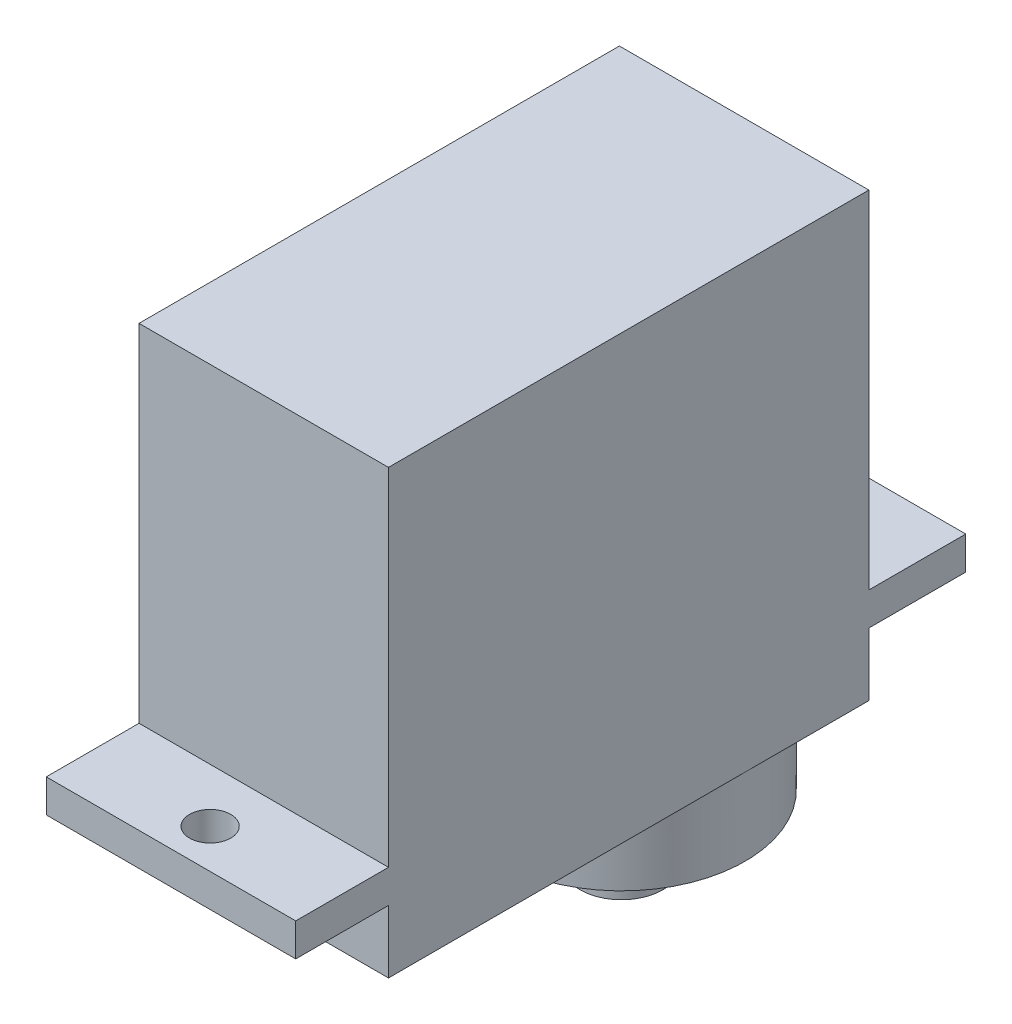
ISO-10303-21;
HEADER;
FILE_DESCRIPTION(('STEP AP214'),'2;1');
FILE_NAME('part.step','',(''),(''),'','','');
FILE_SCHEMA(('AUTOMOTIVE_DESIGN { 1 0 10303 214 1 1 1 1 }'));
ENDSEC;
DATA;
#1=APPLICATION_CONTEXT('core data for automotive mechanical design processes');
#2=APPLICATION_PROTOCOL_DEFINITION('international standard','automotive_design',2000,#1);
#3=PRODUCT_CONTEXT('',#1,'mechanical');
#4=PRODUCT('Part','Part','',(#3));
#5=PRODUCT_RELATED_PRODUCT_CATEGORY('part','',(#4));
#6=PRODUCT_DEFINITION_FORMATION('','',#4);
#7=PRODUCT_DEFINITION_CONTEXT('part definition',#1,'design');
#8=PRODUCT_DEFINITION('design','',#6,#7);
#9=PRODUCT_DEFINITION_SHAPE('','',#8);
#10=(LENGTH_UNIT() NAMED_UNIT(*) SI_UNIT(.MILLI.,.METRE.));
#11=(NAMED_UNIT(*) PLANE_ANGLE_UNIT() SI_UNIT($,.RADIAN.));
#12=(NAMED_UNIT(*) SI_UNIT($,.STERADIAN.) SOLID_ANGLE_UNIT());
#13=UNCERTAINTY_MEASURE_WITH_UNIT(LENGTH_MEASURE(1.E-05),#10,'distance_accuracy_value','');
#14=(GEOMETRIC_REPRESENTATION_CONTEXT(3) GLOBAL_UNCERTAINTY_ASSIGNED_CONTEXT((#13)) GLOBAL_UNIT_ASSIGNED_CONTEXT((#10,
#11,#12)) REPRESENTATION_CONTEXT('',''));
#15=CARTESIAN_POINT('',(0.,0.,0.));
#16=DIRECTION('',(0.,0.,1.));
#17=DIRECTION('',(1.,0.,0.));
#18=AXIS2_PLACEMENT_3D('',#15,#16,#17);
#19=CARTESIAN_POINT('',(4.62906680834214E-07,-15.5159,-5.00154516457114));
#20=DIRECTION('',(0.,1.,0.));
#21=DIRECTION('',(0.,0.,1.));
#22=AXIS2_PLACEMENT_3D('',#19,#20,#21);
#23=CYLINDRICAL_SURFACE('',#22,1.99999996773667);
#24=CARTESIAN_POINT('',(4.62906680834214E-07,-15.5159,-5.00154516457114));
#25=DIRECTION('',(0.,1.,0.));
#26=DIRECTION('',(0.,0.,1.));
#27=AXIS2_PLACEMENT_3D('',#24,#25,#26);
#28=CIRCLE('',#27,1.99999996773667);
#29=CARTESIAN_POINT('',(4.62906680834214E-07,-15.5159,-3.00154519683447));
#30=VERTEX_POINT('',#29);
#31=EDGE_CURVE('E12',#30,#30,#28,.T.);
#32=ORIENTED_EDGE('',*,*,#31,.T.);
#33=EDGE_LOOP('',(#32));
#34=FACE_BOUND('',#33,.T.);
#35=CARTESIAN_POINT('',(4.62906680834214E-07,-12.3159,-5.00154516457114));
#36=DIRECTION('',(0.,1.,0.));
#37=DIRECTION('',(0.,0.,1.));
#38=AXIS2_PLACEMENT_3D('',#35,#36,#37);
#39=CIRCLE('',#38,1.99999996773667);
#40=CARTESIAN_POINT('',(4.62906680834214E-07,-12.3159,-3.00154519683447));
#41=VERTEX_POINT('',#40);
#42=EDGE_CURVE('E62',#41,#41,#39,.T.);
#43=ORIENTED_EDGE('',*,*,#42,.F.);
#44=EDGE_LOOP('',(#43));
#45=FACE_BOUND('',#44,.T.);
#46=ADVANCED_FACE('F59',(#34,#45),#23,.T.);
#47=CARTESIAN_POINT('',(0.,-12.3159,0.));
#48=DIRECTION('',(0.,1.,0.));
#49=DIRECTION('',(0.,0.,1.));
#50=AXIS2_PLACEMENT_3D('',#47,#48,#49);
#51=PLANE('',#50);
#52=CARTESIAN_POINT('',(4.62906680834214E-07,-12.3159,-5.00154516457114));
#53=DIRECTION('',(0.,1.,0.));
#54=DIRECTION('',(0.,0.,1.));
#55=AXIS2_PLACEMENT_3D('',#52,#53,#54);
#56=CIRCLE('',#55,1.25000000033662);
#57=CARTESIAN_POINT('',(4.62906680834214E-07,-12.3159,-3.75154516423452));
#58=VERTEX_POINT('',#57);
#59=EDGE_CURVE('E69',#58,#58,#56,.T.);
#60=ORIENTED_EDGE('',*,*,#59,.F.);
#61=EDGE_LOOP('',(#60));
#62=FACE_BOUND('',#61,.T.);
#63=ORIENTED_EDGE('',*,*,#42,.T.);
#64=EDGE_LOOP('',(#63));
#65=FACE_BOUND('',#64,.T.);
#66=ADVANCED_FACE('F87',(#62,#65),#51,.T.);
#67=CARTESIAN_POINT('',(0.,-15.5159,0.));
#68=DIRECTION('',(0.,1.,0.));
#69=DIRECTION('',(0.,0.,1.));
#70=AXIS2_PLACEMENT_3D('',#67,#68,#69);
#71=PLANE('',#70);
#72=CARTESIAN_POINT('',(4.62906680834214E-07,-15.5159,-5.00154516457114));
#73=DIRECTION('',(0.,1.,0.));
#74=DIRECTION('',(0.,0.,1.));
#75=AXIS2_PLACEMENT_3D('',#72,#73,#74);
#76=CIRCLE('',#75,1.25000000033662);
#77=CARTESIAN_POINT('',(4.62906680834214E-07,-15.5159,-3.75154516423452));
#78=VERTEX_POINT('',#77);
#79=EDGE_CURVE('E73',#78,#78,#76,.T.);
#80=ORIENTED_EDGE('',*,*,#79,.T.);
#81=EDGE_LOOP('',(#80));
#82=FACE_BOUND('',#81,.T.);
#83=ORIENTED_EDGE('',*,*,#31,.F.);
#84=EDGE_LOOP('',(#83));
#85=FACE_BOUND('',#84,.T.);
#86=ADVANCED_FACE('F77',(#82,#85),#71,.F.);
#87=CARTESIAN_POINT('',(4.62906680834214E-07,-15.5159,-5.00154516457114));
#88=DIRECTION('',(0.,1.,0.));
#89=DIRECTION('',(0.,0.,1.));
#90=AXIS2_PLACEMENT_3D('',#87,#88,#89);
#91=CYLINDRICAL_SURFACE('',#90,1.25000000033662);
#92=ORIENTED_EDGE('',*,*,#59,.T.);
#93=EDGE_LOOP('',(#92));
#94=FACE_BOUND('',#93,.T.);
#95=ORIENTED_EDGE('',*,*,#79,.F.);
#96=EDGE_LOOP('',(#95));
#97=FACE_BOUND('',#96,.T.);
#98=ADVANCED_FACE('F80',(#94,#97),#91,.F.);
#99=CLOSED_SHELL('',(#46,#66,#86,#98));
#100=MANIFOLD_SOLID_BREP('B2',#99);
#101=CARTESIAN_POINT('',(6.05,-8.5159,16.8485));
#102=DIRECTION('',(0.,0.,-1.));
#103=DIRECTION('',(-1.,0.,0.));
#104=AXIS2_PLACEMENT_3D('',#101,#102,#103);
#105=PLANE('',#104);
#106=DIRECTION('',(-1.,0.,0.));
#107=VECTOR('',#106,1.);
#108=CARTESIAN_POINT('',(6.05,-5.46581,16.8485));
#109=LINE('',#108,#107);
#110=CARTESIAN_POINT('',(6.05,-5.46581,16.8485));
#111=VERTEX_POINT('',#110);
#112=CARTESIAN_POINT('',(-6.05,-5.46581,16.8485));
#113=VERTEX_POINT('',#112);
#114=EDGE_CURVE('E138',#111,#113,#109,.T.);
#115=ORIENTED_EDGE('',*,*,#114,.F.);
#116=DIRECTION('',(0.,-1.,0.));
#117=VECTOR('',#116,1.);
#118=CARTESIAN_POINT('',(6.05,-8.5159,16.8485));
#119=LINE('',#118,#117);
#120=CARTESIAN_POINT('',(6.05,-3.86581,16.8485));
#121=VERTEX_POINT('',#120);
#122=EDGE_CURVE('E311',#121,#111,#119,.T.);
#123=ORIENTED_EDGE('',*,*,#122,.F.);
#124=DIRECTION('',(-1.,0.,0.));
#125=VECTOR('',#124,1.);
#126=CARTESIAN_POINT('',(6.05,-3.86581,16.8485));
#127=LINE('',#126,#125);
#128=CARTESIAN_POINT('',(-6.05,-3.86581,16.8485));
#129=VERTEX_POINT('',#128);
#130=EDGE_CURVE('E292',#121,#129,#127,.T.);
#131=ORIENTED_EDGE('',*,*,#130,.T.);
#132=DIRECTION('',(0.,-1.,0.));
#133=VECTOR('',#132,1.);
#134=CARTESIAN_POINT('',(-6.05,-8.5159,16.8485));
#135=LINE('',#134,#133);
#136=EDGE_CURVE('E310',#129,#113,#135,.T.);
#137=ORIENTED_EDGE('',*,*,#136,.T.);
#138=EDGE_LOOP('',(#115,#123,#131,#137));
#139=FACE_BOUND('',#138,.T.);
#140=ADVANCED_FACE('F130',(#139),#105,.F.);
#141=CARTESIAN_POINT('',(6.05,-8.5159,-15.6515));
#142=DIRECTION('',(0.,0.,1.));
#143=DIRECTION('',(1.,0.,0.));
#144=AXIS2_PLACEMENT_3D('',#141,#142,#143);
#145=PLANE('',#144);
#146=DIRECTION('',(1.,0.,0.));
#147=VECTOR('',#146,1.);
#148=CARTESIAN_POINT('',(6.05,-5.46581,-15.6515));
#149=LINE('',#148,#147);
#150=CARTESIAN_POINT('',(-6.05,-5.46581,-15.6515));
#151=VERTEX_POINT('',#150);
#152=CARTESIAN_POINT('',(6.05,-5.46581,-15.6515));
#153=VERTEX_POINT('',#152);
#154=EDGE_CURVE('E332',#151,#153,#149,.T.);
#155=ORIENTED_EDGE('',*,*,#154,.F.);
#156=DIRECTION('',(0.,1.,0.));
#157=VECTOR('',#156,1.);
#158=CARTESIAN_POINT('',(-6.05,-8.5159,-15.6515));
#159=LINE('',#158,#157);
#160=CARTESIAN_POINT('',(-6.05,-3.86581,-15.6515));
#161=VERTEX_POINT('',#160);
#162=EDGE_CURVE('E327',#151,#161,#159,.T.);
#163=ORIENTED_EDGE('',*,*,#162,.T.);
#164=DIRECTION('',(1.,0.,0.));
#165=VECTOR('',#164,1.);
#166=CARTESIAN_POINT('',(6.05,-3.86581,-15.6515));
#167=LINE('',#166,#165);
#168=CARTESIAN_POINT('',(6.05,-3.86581,-15.6515));
#169=VERTEX_POINT('',#168);
#170=EDGE_CURVE('E307',#161,#169,#167,.T.);
#171=ORIENTED_EDGE('',*,*,#170,.T.);
#172=DIRECTION('',(0.,1.,0.));
#173=VECTOR('',#172,1.);
#174=CARTESIAN_POINT('',(6.05,-8.5159,-15.6515));
#175=LINE('',#174,#173);
#176=EDGE_CURVE('E318',#153,#169,#175,.T.);
#177=ORIENTED_EDGE('',*,*,#176,.F.);
#178=EDGE_LOOP('',(#155,#163,#171,#177));
#179=FACE_BOUND('',#178,.T.);
#180=ADVANCED_FACE('F368',(#179),#145,.F.);
#181=CARTESIAN_POINT('',(6.05,12.9341,16.8485));
#182=DIRECTION('',(0.,-1.,0.));
#183=DIRECTION('',(0.,0.,-1.));
#184=AXIS2_PLACEMENT_3D('',#181,#182,#183);
#185=PLANE('',#184);
#186=DIRECTION('',(1.,0.,0.));
#187=VECTOR('',#186,1.);
#188=CARTESIAN_POINT('',(-6.05,12.9341,-10.95155));
#189=LINE('',#188,#187);
#190=CARTESIAN_POINT('',(-6.05,12.9341,-10.95155));
#191=VERTEX_POINT('',#190);
#192=CARTESIAN_POINT('',(6.05,12.9341,-10.95155));
#193=VERTEX_POINT('',#192);
#194=EDGE_CURVE('E278',#191,#193,#189,.T.);
#195=ORIENTED_EDGE('',*,*,#194,.F.);
#196=DIRECTION('',(0.,0.,1.));
#197=VECTOR('',#196,1.);
#198=CARTESIAN_POINT('',(-6.05,12.9341,16.8485));
#199=LINE('',#198,#197);
#200=CARTESIAN_POINT('',(-6.05,12.9341,12.3484));
#201=VERTEX_POINT('',#200);
#202=EDGE_CURVE('E315',#191,#201,#199,.T.);
#203=ORIENTED_EDGE('',*,*,#202,.T.);
#204=DIRECTION('',(-1.,0.,0.));
#205=VECTOR('',#204,1.);
#206=CARTESIAN_POINT('',(-6.05,12.9341,12.3484));
#207=LINE('',#206,#205);
#208=CARTESIAN_POINT('',(6.05,12.9341,12.3484));
#209=VERTEX_POINT('',#208);
#210=EDGE_CURVE('E297',#209,#201,#207,.T.);
#211=ORIENTED_EDGE('',*,*,#210,.F.);
#212=DIRECTION('',(0.,0.,1.));
#213=VECTOR('',#212,1.);
#214=CARTESIAN_POINT('',(6.05,12.9341,16.8485));
#215=LINE('',#214,#213);
#216=EDGE_CURVE('E320',#193,#209,#215,.T.);
#217=ORIENTED_EDGE('',*,*,#216,.F.);
#218=EDGE_LOOP('',(#195,#203,#211,#217));
#219=FACE_BOUND('',#218,.T.);
#220=ADVANCED_FACE('F385',(#219),#185,.F.);
#221=CARTESIAN_POINT('',(6.05,0.,0.));
#222=DIRECTION('',(-1.,0.,0.));
#223=DIRECTION('',(0.,0.,1.));
#224=AXIS2_PLACEMENT_3D('',#221,#222,#223);
#225=PLANE('',#224);
#226=DIRECTION('',(0.,0.,-1.));
#227=VECTOR('',#226,1.);
#228=CARTESIAN_POINT('',(6.05,-8.5159,16.8485));
#229=LINE('',#228,#227);
#230=CARTESIAN_POINT('',(6.05,-8.5159,12.3484));
#231=VERTEX_POINT('',#230);
#232=CARTESIAN_POINT('',(6.05,-8.5159,-10.95155));
#233=VERTEX_POINT('',#232);
#234=EDGE_CURVE('E314',#231,#233,#229,.T.);
#235=ORIENTED_EDGE('',*,*,#234,.T.);
#236=DIRECTION('',(0.,1.,0.));
#237=VECTOR('',#236,1.);
#238=CARTESIAN_POINT('',(6.05,-8.5159,-10.95155));
#239=LINE('',#238,#237);
#240=CARTESIAN_POINT('',(6.05,-5.46581,-10.95155));
#241=VERTEX_POINT('',#240);
#242=EDGE_CURVE('E247',#233,#241,#239,.T.);
#243=ORIENTED_EDGE('',*,*,#242,.T.);
#244=DIRECTION('',(0.,0.,-1.));
#245=VECTOR('',#244,1.);
#246=CARTESIAN_POINT('',(6.05,-5.46581,-10.95155));
#247=LINE('',#246,#245);
#248=EDGE_CURVE('E251',#241,#153,#247,.T.);
#249=ORIENTED_EDGE('',*,*,#248,.T.);
#250=ORIENTED_EDGE('',*,*,#176,.T.);
#251=DIRECTION('',(0.,0.,-1.));
#252=VECTOR('',#251,1.);
#253=CARTESIAN_POINT('',(6.05,-3.86581,-10.95155));
#254=LINE('',#253,#252);
#255=CARTESIAN_POINT('',(6.05,-3.86581,-10.95155));
#256=VERTEX_POINT('',#255);
#257=EDGE_CURVE('E281',#256,#169,#254,.T.);
#258=ORIENTED_EDGE('',*,*,#257,.F.);
#259=DIRECTION('',(0.,-1.,0.));
#260=VECTOR('',#259,1.);
#261=CARTESIAN_POINT('',(6.05,12.9341,-10.95155));
#262=LINE('',#261,#260);
#263=EDGE_CURVE('E280',#193,#256,#262,.T.);
#264=ORIENTED_EDGE('',*,*,#263,.F.);
#265=ORIENTED_EDGE('',*,*,#216,.T.);
#266=DIRECTION('',(0.,-1.,0.));
#267=VECTOR('',#266,1.);
#268=CARTESIAN_POINT('',(6.05,12.9341,12.3484));
#269=LINE('',#268,#267);
#270=CARTESIAN_POINT('',(6.05,-3.86581,12.3484));
#271=VERTEX_POINT('',#270);
#272=EDGE_CURVE('E262',#209,#271,#269,.T.);
#273=ORIENTED_EDGE('',*,*,#272,.T.);
#274=DIRECTION('',(0.,0.,-1.));
#275=VECTOR('',#274,1.);
#276=CARTESIAN_POINT('',(6.05,-3.86581,16.9484));
#277=LINE('',#276,#275);
#278=EDGE_CURVE('E301',#121,#271,#277,.T.);
#279=ORIENTED_EDGE('',*,*,#278,.F.);
#280=ORIENTED_EDGE('',*,*,#122,.T.);
#281=DIRECTION('',(0.,0.,-1.));
#282=VECTOR('',#281,1.);
#283=CARTESIAN_POINT('',(6.05,-5.46581,16.9484));
#284=LINE('',#283,#282);
#285=CARTESIAN_POINT('',(6.05,-5.46581,12.3484));
#286=VERTEX_POINT('',#285);
#287=EDGE_CURVE('E271',#111,#286,#284,.T.);
#288=ORIENTED_EDGE('',*,*,#287,.T.);
#289=DIRECTION('',(0.,1.,0.));
#290=VECTOR('',#289,1.);
#291=CARTESIAN_POINT('',(6.05,-8.5159,12.3484));
#292=LINE('',#291,#290);
#293=EDGE_CURVE('E266',#231,#286,#292,.T.);
#294=ORIENTED_EDGE('',*,*,#293,.F.);
#295=EDGE_LOOP('',(#235,#243,#249,#250,#258,#264,#265,#273,#279,#280,#288,#294));
#296=FACE_BOUND('',#295,.T.);
#297=ADVANCED_FACE('F382',(#296),#225,.F.);
#298=CARTESIAN_POINT('',(-6.05,0.,0.));
#299=DIRECTION('',(-1.,0.,0.));
#300=DIRECTION('',(0.,0.,1.));
#301=AXIS2_PLACEMENT_3D('',#298,#299,#300);
#302=PLANE('',#301);
#303=DIRECTION('',(0.,1.,0.));
#304=VECTOR('',#303,1.);
#305=CARTESIAN_POINT('',(-6.05,-8.5159,-10.95155));
#306=LINE('',#305,#304);
#307=CARTESIAN_POINT('',(-6.05,-8.5159,-10.95155));
#308=VERTEX_POINT('',#307);
#309=CARTESIAN_POINT('',(-6.05,-5.46581,-10.95155));
#310=VERTEX_POINT('',#309);
#311=EDGE_CURVE('E246',#308,#310,#306,.T.);
#312=ORIENTED_EDGE('',*,*,#311,.F.);
#313=DIRECTION('',(0.,0.,-1.));
#314=VECTOR('',#313,1.);
#315=CARTESIAN_POINT('',(-6.05,-8.5159,16.8485));
#316=LINE('',#315,#314);
#317=CARTESIAN_POINT('',(-6.05,-8.5159,12.3484));
#318=VERTEX_POINT('',#317);
#319=EDGE_CURVE('E245',#318,#308,#316,.T.);
#320=ORIENTED_EDGE('',*,*,#319,.F.);
#321=DIRECTION('',(0.,1.,0.));
#322=VECTOR('',#321,1.);
#323=CARTESIAN_POINT('',(-6.05,-8.5159,12.3484));
#324=LINE('',#323,#322);
#325=CARTESIAN_POINT('',(-6.05,-5.46581,12.3484));
#326=VERTEX_POINT('',#325);
#327=EDGE_CURVE('E153',#318,#326,#324,.T.);
#328=ORIENTED_EDGE('',*,*,#327,.T.);
#329=DIRECTION('',(0.,0.,1.));
#330=VECTOR('',#329,1.);
#331=CARTESIAN_POINT('',(-6.05,-5.46581,16.9484));
#332=LINE('',#331,#330);
#333=EDGE_CURVE('E268',#326,#113,#332,.T.);
#334=ORIENTED_EDGE('',*,*,#333,.T.);
#335=ORIENTED_EDGE('',*,*,#136,.F.);
#336=DIRECTION('',(0.,0.,1.));
#337=VECTOR('',#336,1.);
#338=CARTESIAN_POINT('',(-6.05,-3.86581,16.9484));
#339=LINE('',#338,#337);
#340=CARTESIAN_POINT('',(-6.05,-3.86581,12.3484));
#341=VERTEX_POINT('',#340);
#342=EDGE_CURVE('E284',#341,#129,#339,.T.);
#343=ORIENTED_EDGE('',*,*,#342,.F.);
#344=DIRECTION('',(0.,-1.,0.));
#345=VECTOR('',#344,1.);
#346=CARTESIAN_POINT('',(-6.05,12.9341,12.3484));
#347=LINE('',#346,#345);
#348=EDGE_CURVE('E295',#201,#341,#347,.T.);
#349=ORIENTED_EDGE('',*,*,#348,.F.);
#350=ORIENTED_EDGE('',*,*,#202,.F.);
#351=DIRECTION('',(0.,-1.,0.));
#352=VECTOR('',#351,1.);
#353=CARTESIAN_POINT('',(-6.05,12.9341,-10.95155));
#354=LINE('',#353,#352);
#355=CARTESIAN_POINT('',(-6.05,-3.86581,-10.95155));
#356=VERTEX_POINT('',#355);
#357=EDGE_CURVE('E289',#191,#356,#354,.T.);
#358=ORIENTED_EDGE('',*,*,#357,.T.);
#359=DIRECTION('',(0.,0.,1.));
#360=VECTOR('',#359,1.);
#361=CARTESIAN_POINT('',(-6.05,-3.86581,0.));
#362=LINE('',#361,#360);
#363=EDGE_CURVE('E323',#161,#356,#362,.T.);
#364=ORIENTED_EDGE('',*,*,#363,.F.);
#365=ORIENTED_EDGE('',*,*,#162,.F.);
#366=DIRECTION('',(0.,0.,1.));
#367=VECTOR('',#366,1.);
#368=CARTESIAN_POINT('',(-6.05,-5.46581,-10.95155));
#369=LINE('',#368,#367);
#370=EDGE_CURVE('E259',#151,#310,#369,.T.);
#371=ORIENTED_EDGE('',*,*,#370,.T.);
#372=EDGE_LOOP('',(#312,#320,#328,#334,#335,#343,#349,#350,#358,#364,#365,#371));
#373=FACE_BOUND('',#372,.T.);
#374=ADVANCED_FACE('F372',(#373),#302,.T.);
#375=CARTESIAN_POINT('',(6.05,-8.5159,16.8485));
#376=DIRECTION('',(0.,1.,0.));
#377=DIRECTION('',(0.,0.,1.));
#378=AXIS2_PLACEMENT_3D('',#375,#376,#377);
#379=PLANE('',#378);
#380=DIRECTION('',(1.,0.,0.));
#381=VECTOR('',#380,1.);
#382=CARTESIAN_POINT('',(-6.05,-8.5159,-10.95155));
#383=LINE('',#382,#381);
#384=CARTESIAN_POINT('',(-0.772944157206527,-8.5159,-10.95155));
#385=VERTEX_POINT('',#384);
#386=EDGE_CURVE('E237',#308,#385,#383,.T.);
#387=ORIENTED_EDGE('',*,*,#386,.T.);
#388=CARTESIAN_POINT('',(4.62906680834214E-07,-8.5159,-5.00154516457114));
#389=DIRECTION('',(0.,1.,0.));
#390=DIRECTION('',(0.,0.,1.));
#391=AXIS2_PLACEMENT_3D('',#388,#389,#390);
#392=CIRCLE('',#391,6.0000000772824);
#393=CARTESIAN_POINT('',(0.772945083019889,-8.5159,-10.95155));
#394=VERTEX_POINT('',#393);
#395=EDGE_CURVE('E57',#385,#394,#392,.T.);
#396=ORIENTED_EDGE('',*,*,#395,.T.);
#397=EDGE_CURVE('E240',#394,#233,#383,.T.);
#398=ORIENTED_EDGE('',*,*,#397,.T.);
#399=ORIENTED_EDGE('',*,*,#234,.F.);
#400=DIRECTION('',(-1.,0.,0.));
#401=VECTOR('',#400,1.);
#402=CARTESIAN_POINT('',(-6.05,-8.5159,12.3484));
#403=LINE('',#402,#401);
#404=EDGE_CURVE('E264',#231,#318,#403,.T.);
#405=ORIENTED_EDGE('',*,*,#404,.T.);
#406=ORIENTED_EDGE('',*,*,#319,.T.);
#407=EDGE_LOOP('',(#387,#396,#398,#399,#405,#406));
#408=FACE_BOUND('',#407,.T.);
#409=ADVANCED_FACE('F243',(#408),#379,.F.);
#410=CARTESIAN_POINT('',(0.,-3.86581,0.));
#411=DIRECTION('',(0.,-1.,0.));
#412=DIRECTION('',(0.,0.,-1.));
#413=AXIS2_PLACEMENT_3D('',#410,#411,#412);
#414=PLANE('',#413);
#415=CARTESIAN_POINT('',(0.,-3.86581,14.9492386825214));
#416=DIRECTION('',(0.,-1.,0.));
#417=DIRECTION('',(0.,0.,-1.));
#418=AXIS2_PLACEMENT_3D('',#415,#416,#417);
#419=CIRCLE('',#418,1.);
#420=CARTESIAN_POINT('',(0.,-3.86581,13.9492386825214));
#421=VERTEX_POINT('',#420);
#422=EDGE_CURVE('E336',#421,#421,#419,.T.);
#423=ORIENTED_EDGE('',*,*,#422,.T.);
#424=EDGE_LOOP('',(#423));
#425=FACE_BOUND('',#424,.T.);
#426=ORIENTED_EDGE('',*,*,#278,.T.);
#427=DIRECTION('',(-1.,0.,0.));
#428=VECTOR('',#427,1.);
#429=CARTESIAN_POINT('',(-6.05,-3.86581,12.3484));
#430=LINE('',#429,#428);
#431=EDGE_CURVE('E298',#271,#341,#430,.T.);
#432=ORIENTED_EDGE('',*,*,#431,.T.);
#433=ORIENTED_EDGE('',*,*,#342,.T.);
#434=ORIENTED_EDGE('',*,*,#130,.F.);
#435=EDGE_LOOP('',(#426,#432,#433,#434));
#436=FACE_BOUND('',#435,.T.);
#437=ADVANCED_FACE('F409',(#425,#436),#414,.F.);
#438=CARTESIAN_POINT('',(-6.05,12.9341,12.3484));
#439=DIRECTION('',(0.,0.,1.));
#440=DIRECTION('',(1.,0.,0.));
#441=AXIS2_PLACEMENT_3D('',#438,#439,#440);
#442=PLANE('',#441);
#443=ORIENTED_EDGE('',*,*,#431,.F.);
#444=ORIENTED_EDGE('',*,*,#272,.F.);
#445=ORIENTED_EDGE('',*,*,#210,.T.);
#446=ORIENTED_EDGE('',*,*,#348,.T.);
#447=EDGE_LOOP('',(#443,#444,#445,#446));
#448=FACE_BOUND('',#447,.T.);
#449=ADVANCED_FACE('F412',(#448),#442,.T.);
#450=CARTESIAN_POINT('',(0.,-3.86581,0.));
#451=DIRECTION('',(0.,-1.,0.));
#452=DIRECTION('',(0.,0.,-1.));
#453=AXIS2_PLACEMENT_3D('',#450,#451,#452);
#454=PLANE('',#453);
#455=CARTESIAN_POINT('',(0.,-3.86581,-13.55));
#456=DIRECTION('',(0.,-1.,0.));
#457=DIRECTION('',(0.,0.,-1.));
#458=AXIS2_PLACEMENT_3D('',#455,#456,#457);
#459=CIRCLE('',#458,1.);
#460=CARTESIAN_POINT('',(0.,-3.86581,-14.55));
#461=VERTEX_POINT('',#460);
#462=EDGE_CURVE('E272',#461,#461,#459,.T.);
#463=ORIENTED_EDGE('',*,*,#462,.T.);
#464=EDGE_LOOP('',(#463));
#465=FACE_BOUND('',#464,.T.);
#466=ORIENTED_EDGE('',*,*,#363,.T.);
#467=DIRECTION('',(1.,0.,0.));
#468=VECTOR('',#467,1.);
#469=CARTESIAN_POINT('',(-6.05,-3.86581,-10.95155));
#470=LINE('',#469,#468);
#471=EDGE_CURVE('E282',#356,#256,#470,.T.);
#472=ORIENTED_EDGE('',*,*,#471,.T.);
#473=ORIENTED_EDGE('',*,*,#257,.T.);
#474=ORIENTED_EDGE('',*,*,#170,.F.);
#475=EDGE_LOOP('',(#466,#472,#473,#474));
#476=FACE_BOUND('',#475,.T.);
#477=ADVANCED_FACE('F376',(#465,#476),#454,.F.);
#478=CARTESIAN_POINT('',(-6.05,12.9341,-10.95155));
#479=DIRECTION('',(0.,0.,-1.));
#480=DIRECTION('',(-1.,0.,0.));
#481=AXIS2_PLACEMENT_3D('',#478,#479,#480);
#482=PLANE('',#481);
#483=ORIENTED_EDGE('',*,*,#471,.F.);
#484=ORIENTED_EDGE('',*,*,#357,.F.);
#485=ORIENTED_EDGE('',*,*,#194,.T.);
#486=ORIENTED_EDGE('',*,*,#263,.T.);
#487=EDGE_LOOP('',(#483,#484,#485,#486));
#488=FACE_BOUND('',#487,.T.);
#489=ADVANCED_FACE('F361',(#488),#482,.T.);
#490=CARTESIAN_POINT('',(0.,-5.46581,0.));
#491=DIRECTION('',(0.,-1.,0.));
#492=DIRECTION('',(0.,0.,-1.));
#493=AXIS2_PLACEMENT_3D('',#490,#491,#492);
#494=PLANE('',#493);
#495=CARTESIAN_POINT('',(0.,-5.46581,-13.55));
#496=DIRECTION('',(0.,-1.,0.));
#497=DIRECTION('',(0.,0.,-1.));
#498=AXIS2_PLACEMENT_3D('',#495,#496,#497);
#499=CIRCLE('',#498,1.);
#500=CARTESIAN_POINT('',(0.,-5.46581,-14.55));
#501=VERTEX_POINT('',#500);
#502=EDGE_CURVE('E133',#501,#501,#499,.T.);
#503=ORIENTED_EDGE('',*,*,#502,.F.);
#504=EDGE_LOOP('',(#503));
#505=FACE_BOUND('',#504,.T.);
#506=ORIENTED_EDGE('',*,*,#154,.T.);
#507=ORIENTED_EDGE('',*,*,#248,.F.);
#508=DIRECTION('',(1.,0.,0.));
#509=VECTOR('',#508,1.);
#510=CARTESIAN_POINT('',(-6.05,-5.46581,-10.95155));
#511=LINE('',#510,#509);
#512=EDGE_CURVE('E254',#310,#241,#511,.T.);
#513=ORIENTED_EDGE('',*,*,#512,.F.);
#514=ORIENTED_EDGE('',*,*,#370,.F.);
#515=EDGE_LOOP('',(#506,#507,#513,#514));
#516=FACE_BOUND('',#515,.T.);
#517=ADVANCED_FACE('F358',(#505,#516),#494,.T.);
#518=CARTESIAN_POINT('',(-6.05,-8.5159,-10.95155));
#519=DIRECTION('',(0.,0.,1.));
#520=DIRECTION('',(1.,0.,0.));
#521=AXIS2_PLACEMENT_3D('',#518,#519,#520);
#522=PLANE('',#521);
#523=ORIENTED_EDGE('',*,*,#512,.T.);
#524=ORIENTED_EDGE('',*,*,#242,.F.);
#525=ORIENTED_EDGE('',*,*,#397,.F.);
#526=EDGE_CURVE('E231',#385,#394,#383,.T.);
#527=ORIENTED_EDGE('',*,*,#526,.F.);
#528=ORIENTED_EDGE('',*,*,#386,.F.);
#529=ORIENTED_EDGE('',*,*,#311,.T.);
#530=EDGE_LOOP('',(#523,#524,#525,#527,#528,#529));
#531=FACE_BOUND('',#530,.T.);
#532=ADVANCED_FACE('F236',(#531),#522,.F.);
#533=CARTESIAN_POINT('',(0.,-5.46581,0.));
#534=DIRECTION('',(0.,-1.,0.));
#535=DIRECTION('',(0.,0.,-1.));
#536=AXIS2_PLACEMENT_3D('',#533,#534,#535);
#537=PLANE('',#536);
#538=CARTESIAN_POINT('',(0.,-5.46581,14.9492386825214));
#539=DIRECTION('',(0.,-1.,0.));
#540=DIRECTION('',(0.,0.,-1.));
#541=AXIS2_PLACEMENT_3D('',#538,#539,#540);
#542=CIRCLE('',#541,1.);
#543=CARTESIAN_POINT('',(0.,-5.46581,13.9492386825214));
#544=VERTEX_POINT('',#543);
#545=EDGE_CURVE('E334',#544,#544,#542,.T.);
#546=ORIENTED_EDGE('',*,*,#545,.F.);
#547=EDGE_LOOP('',(#546));
#548=FACE_BOUND('',#547,.T.);
#549=ORIENTED_EDGE('',*,*,#114,.T.);
#550=ORIENTED_EDGE('',*,*,#333,.F.);
#551=DIRECTION('',(-1.,0.,0.));
#552=VECTOR('',#551,1.);
#553=CARTESIAN_POINT('',(-6.05,-5.46581,12.3484));
#554=LINE('',#553,#552);
#555=EDGE_CURVE('E267',#286,#326,#554,.T.);
#556=ORIENTED_EDGE('',*,*,#555,.F.);
#557=ORIENTED_EDGE('',*,*,#287,.F.);
#558=EDGE_LOOP('',(#549,#550,#556,#557));
#559=FACE_BOUND('',#558,.T.);
#560=ADVANCED_FACE('F416',(#548,#559),#537,.T.);
#561=CARTESIAN_POINT('',(-6.05,-8.5159,12.3484));
#562=DIRECTION('',(0.,0.,-1.));
#563=DIRECTION('',(-1.,0.,0.));
#564=AXIS2_PLACEMENT_3D('',#561,#562,#563);
#565=PLANE('',#564);
#566=ORIENTED_EDGE('',*,*,#555,.T.);
#567=ORIENTED_EDGE('',*,*,#327,.F.);
#568=ORIENTED_EDGE('',*,*,#404,.F.);
#569=ORIENTED_EDGE('',*,*,#293,.T.);
#570=EDGE_LOOP('',(#566,#567,#568,#569));
#571=FACE_BOUND('',#570,.T.);
#572=ADVANCED_FACE('F417',(#571),#565,.F.);
#573=CARTESIAN_POINT('',(0.,-8.5159,14.9492386825214));
#574=DIRECTION('',(0.,1.,0.));
#575=DIRECTION('',(0.,0.,1.));
#576=AXIS2_PLACEMENT_3D('',#573,#574,#575);
#577=CYLINDRICAL_SURFACE('',#576,1.);
#578=ORIENTED_EDGE('',*,*,#545,.T.);
#579=EDGE_LOOP('',(#578));
#580=FACE_BOUND('',#579,.T.);
#581=ORIENTED_EDGE('',*,*,#422,.F.);
#582=EDGE_LOOP('',(#581));
#583=FACE_BOUND('',#582,.T.);
#584=ADVANCED_FACE('F419',(#580,#583),#577,.F.);
#585=CARTESIAN_POINT('',(0.,-8.5159,-13.55));
#586=DIRECTION('',(0.,1.,0.));
#587=DIRECTION('',(0.,0.,1.));
#588=AXIS2_PLACEMENT_3D('',#585,#586,#587);
#589=CYLINDRICAL_SURFACE('',#588,1.);
#590=ORIENTED_EDGE('',*,*,#502,.T.);
#591=EDGE_LOOP('',(#590));
#592=FACE_BOUND('',#591,.T.);
#593=ORIENTED_EDGE('',*,*,#462,.F.);
#594=EDGE_LOOP('',(#593));
#595=FACE_BOUND('',#594,.T.);
#596=ADVANCED_FACE('F355',(#592,#595),#589,.F.);
#597=CARTESIAN_POINT('',(4.62906680834214E-07,-12.315,-5.00154516457114));
#598=DIRECTION('',(0.,1.,0.));
#599=DIRECTION('',(0.,0.,1.));
#600=AXIS2_PLACEMENT_3D('',#597,#598,#599);
#601=CYLINDRICAL_SURFACE('',#600,6.0000000772824);
#602=CARTESIAN_POINT('',(4.62906680834214E-07,-12.315,-5.00154516457114));
#603=DIRECTION('',(0.,1.,0.));
#604=DIRECTION('',(0.,0.,1.));
#605=AXIS2_PLACEMENT_3D('',#602,#603,#604);
#606=CIRCLE('',#605,6.0000000772824);
#607=CARTESIAN_POINT('',(4.62906680834214E-07,-12.315,0.998454912711264));
#608=VERTEX_POINT('',#607);
#609=EDGE_CURVE('E232',#608,#608,#606,.T.);
#610=ORIENTED_EDGE('',*,*,#609,.T.);
#611=EDGE_LOOP('',(#610));
#612=FACE_BOUND('',#611,.T.);
#613=EDGE_CURVE('E140',#394,#385,#392,.T.);
#614=ORIENTED_EDGE('',*,*,#613,.F.);
#615=ORIENTED_EDGE('',*,*,#395,.F.);
#616=EDGE_LOOP('',(#614,#615));
#617=FACE_BOUND('',#616,.T.);
#618=ADVANCED_FACE('F224',(#612,#617),#601,.T.);
#619=CARTESIAN_POINT('',(4.62906680834214E-07,-12.315,-5.00154516457114));
#620=DIRECTION('',(0.,1.,0.));
#621=DIRECTION('',(0.,0.,1.));
#622=AXIS2_PLACEMENT_3D('',#619,#620,#621);
#623=CYLINDRICAL_SURFACE('',#622,1.25000000033662);
#624=CARTESIAN_POINT('',(4.62906680834214E-07,-12.315,-5.00154516457114));
#625=DIRECTION('',(0.,1.,0.));
#626=DIRECTION('',(0.,0.,1.));
#627=AXIS2_PLACEMENT_3D('',#624,#625,#626);
#628=CIRCLE('',#627,1.25000000033662);
#629=CARTESIAN_POINT('',(4.62906680834214E-07,-12.315,-3.75154516423452));
#630=VERTEX_POINT('',#629);
#631=EDGE_CURVE('E337',#630,#630,#628,.T.);
#632=ORIENTED_EDGE('',*,*,#631,.F.);
#633=EDGE_LOOP('',(#632));
#634=FACE_BOUND('',#633,.T.);
#635=CARTESIAN_POINT('',(4.62906680834214E-07,0.,-5.00154516457114));
#636=DIRECTION('',(0.,1.,0.));
#637=DIRECTION('',(0.,0.,1.));
#638=AXIS2_PLACEMENT_3D('',#635,#636,#637);
#639=CIRCLE('',#638,1.25000000033662);
#640=CARTESIAN_POINT('',(4.62906680834214E-07,0.,-3.75154516423452));
#641=VERTEX_POINT('',#640);
#642=EDGE_CURVE('E233',#641,#641,#639,.T.);
#643=ORIENTED_EDGE('',*,*,#642,.T.);
#644=EDGE_LOOP('',(#643));
#645=FACE_BOUND('',#644,.T.);
#646=ADVANCED_FACE('F462',(#634,#645),#623,.F.);
#647=CARTESIAN_POINT('',(0.,-12.315,0.));
#648=DIRECTION('',(0.,1.,0.));
#649=DIRECTION('',(0.,0.,1.));
#650=AXIS2_PLACEMENT_3D('',#647,#648,#649);
#651=PLANE('',#650);
#652=ORIENTED_EDGE('',*,*,#609,.F.);
#653=EDGE_LOOP('',(#652));
#654=FACE_BOUND('',#653,.T.);
#655=ORIENTED_EDGE('',*,*,#631,.T.);
#656=EDGE_LOOP('',(#655));
#657=FACE_BOUND('',#656,.T.);
#658=ADVANCED_FACE('F469',(#654,#657),#651,.F.);
#659=CARTESIAN_POINT('',(0.,-8.5159,0.));
#660=DIRECTION('',(0.,1.,0.));
#661=DIRECTION('',(0.,0.,1.));
#662=AXIS2_PLACEMENT_3D('',#659,#660,#661);
#663=PLANE('',#662);
#664=ORIENTED_EDGE('',*,*,#613,.T.);
#665=ORIENTED_EDGE('',*,*,#526,.T.);
#666=EDGE_LOOP('',(#664,#665));
#667=FACE_BOUND('',#666,.T.);
#668=ADVANCED_FACE('F230',(#667),#663,.T.);
#669=CARTESIAN_POINT('',(0.,0.,0.));
#670=DIRECTION('',(0.,1.,0.));
#671=DIRECTION('',(0.,0.,1.));
#672=AXIS2_PLACEMENT_3D('',#669,#670,#671);
#673=PLANE('',#672);
#674=ORIENTED_EDGE('',*,*,#642,.F.);
#675=EDGE_LOOP('',(#674));
#676=FACE_BOUND('',#675,.T.);
#677=ADVANCED_FACE('F482',(#676),#673,.F.);
#678=CLOSED_SHELL('',(#140,#180,#220,#297,#374,#409,#437,#449,#477,#489,#517,#532,#560,#572,
#584,#596,#618,#646,#658,#668,#677));
#679=MANIFOLD_SOLID_BREP('B7',#678);
#680=ADVANCED_BREP_SHAPE_REPRESENTATION('',(#18,#100,#679),#14);
#681=SHAPE_DEFINITION_REPRESENTATION(#9,#680);
ENDSEC;
END-ISO-10303-21;
